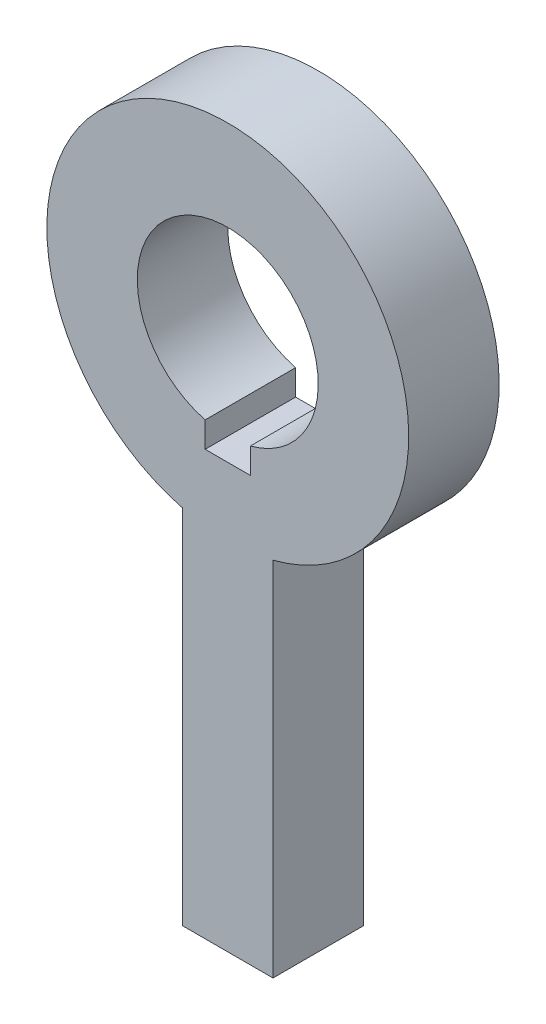
ISO-10303-21;
HEADER;
FILE_DESCRIPTION(('STEP AP214'),'2;1');
FILE_NAME('part.step','',(''),(''),'','','');
FILE_SCHEMA(('AUTOMOTIVE_DESIGN { 1 0 10303 214 1 1 1 1 }'));
ENDSEC;
DATA;
#1=APPLICATION_CONTEXT('core data for automotive mechanical design processes');
#2=APPLICATION_PROTOCOL_DEFINITION('international standard','automotive_design',2000,#1);
#3=PRODUCT_CONTEXT('',#1,'mechanical');
#4=PRODUCT('Part','Part','',(#3));
#5=PRODUCT_RELATED_PRODUCT_CATEGORY('part','',(#4));
#6=PRODUCT_DEFINITION_FORMATION('','',#4);
#7=PRODUCT_DEFINITION_CONTEXT('part definition',#1,'design');
#8=PRODUCT_DEFINITION('design','',#6,#7);
#9=PRODUCT_DEFINITION_SHAPE('','',#8);
#10=(LENGTH_UNIT() NAMED_UNIT(*) SI_UNIT(.MILLI.,.METRE.));
#11=(NAMED_UNIT(*) PLANE_ANGLE_UNIT() SI_UNIT($,.RADIAN.));
#12=(NAMED_UNIT(*) SI_UNIT($,.STERADIAN.) SOLID_ANGLE_UNIT());
#13=UNCERTAINTY_MEASURE_WITH_UNIT(LENGTH_MEASURE(1.E-05),#10,'distance_accuracy_value','');
#14=(GEOMETRIC_REPRESENTATION_CONTEXT(3) GLOBAL_UNCERTAINTY_ASSIGNED_CONTEXT((#13)) GLOBAL_UNIT_ASSIGNED_CONTEXT((#10,
#11,#12)) REPRESENTATION_CONTEXT('',''));
#15=CARTESIAN_POINT('',(0.,0.,0.));
#16=DIRECTION('',(0.,0.,1.));
#17=DIRECTION('',(1.,0.,0.));
#18=AXIS2_PLACEMENT_3D('',#15,#16,#17);
#19=CARTESIAN_POINT('',(0.,0.,10.));
#20=DIRECTION('',(0.,0.,1.));
#21=DIRECTION('',(1.,0.,0.));
#22=AXIS2_PLACEMENT_3D('',#19,#20,#21);
#23=PLANE('',#22);
#24=CARTESIAN_POINT('',(0.,0.,10.));
#25=DIRECTION('',(0.,0.,1.));
#26=DIRECTION('',(1.,0.,0.));
#27=AXIS2_PLACEMENT_3D('',#24,#25,#26);
#28=CIRCLE('',#27,20.);
#29=CARTESIAN_POINT('',(5.,-19.3649167310371,10.));
#30=VERTEX_POINT('',#29);
#31=CARTESIAN_POINT('',(-5.,-19.3649167310371,10.));
#32=VERTEX_POINT('',#31);
#33=EDGE_CURVE('E137',#30,#32,#28,.T.);
#34=ORIENTED_EDGE('',*,*,#33,.T.);
#35=DIRECTION('',(0.,-1.,0.));
#36=VECTOR('',#35,1.);
#37=CARTESIAN_POINT('',(-5.,-59.3649167310371,10.));
#38=LINE('',#37,#36);
#39=CARTESIAN_POINT('',(-5.,-59.3649167310371,10.));
#40=VERTEX_POINT('',#39);
#41=EDGE_CURVE('E140',#32,#40,#38,.T.);
#42=ORIENTED_EDGE('',*,*,#41,.T.);
#43=DIRECTION('',(1.,0.,0.));
#44=VECTOR('',#43,1.);
#45=CARTESIAN_POINT('',(-5.,-59.3649167310371,10.));
#46=LINE('',#45,#44);
#47=CARTESIAN_POINT('',(5.,-59.3649167310371,10.));
#48=VERTEX_POINT('',#47);
#49=EDGE_CURVE('E143',#40,#48,#46,.T.);
#50=ORIENTED_EDGE('',*,*,#49,.T.);
#51=DIRECTION('',(0.,1.,0.));
#52=VECTOR('',#51,1.);
#53=CARTESIAN_POINT('',(5.,-59.3649167310371,10.));
#54=LINE('',#53,#52);
#55=EDGE_CURVE('E145',#48,#30,#54,.T.);
#56=ORIENTED_EDGE('',*,*,#55,.T.);
#57=EDGE_LOOP('',(#34,#42,#50,#56));
#58=FACE_BOUND('',#57,.T.);
#59=DIRECTION('',(1.,0.,0.));
#60=VECTOR('',#59,1.);
#61=CARTESIAN_POINT('',(-2.5,-12.5,10.));
#62=LINE('',#61,#60);
#63=CARTESIAN_POINT('',(-2.5,-12.5,10.));
#64=VERTEX_POINT('',#63);
#65=CARTESIAN_POINT('',(2.5,-12.5,10.));
#66=VERTEX_POINT('',#65);
#67=EDGE_CURVE('E109',#64,#66,#62,.T.);
#68=ORIENTED_EDGE('',*,*,#67,.F.);
#69=DIRECTION('',(0.,-1.,0.));
#70=VECTOR('',#69,1.);
#71=CARTESIAN_POINT('',(-2.5,-12.5,10.));
#72=LINE('',#71,#70);
#73=CARTESIAN_POINT('',(-2.49999999999999,-9.68245836551854,10.));
#74=VERTEX_POINT('',#73);
#75=EDGE_CURVE('E101',#74,#64,#72,.T.);
#76=ORIENTED_EDGE('',*,*,#75,.F.);
#77=CARTESIAN_POINT('',(0.,0.,10.));
#78=DIRECTION('',(0.,0.,1.));
#79=DIRECTION('',(1.,0.,0.));
#80=AXIS2_PLACEMENT_3D('',#77,#78,#79);
#81=CIRCLE('',#80,10.);
#82=CARTESIAN_POINT('',(2.5,-9.68245836551854,10.));
#83=VERTEX_POINT('',#82);
#84=EDGE_CURVE('E123',#83,#74,#81,.T.);
#85=ORIENTED_EDGE('',*,*,#84,.F.);
#86=DIRECTION('',(0.,1.,0.));
#87=VECTOR('',#86,1.);
#88=CARTESIAN_POINT('',(2.5,-12.5,10.));
#89=LINE('',#88,#87);
#90=EDGE_CURVE('E121',#66,#83,#89,.T.);
#91=ORIENTED_EDGE('',*,*,#90,.F.);
#92=EDGE_LOOP('',(#68,#76,#85,#91));
#93=FACE_BOUND('',#92,.T.);
#94=ADVANCED_FACE('F36',(#58,#93),#23,.T.);
#95=CARTESIAN_POINT('',(0.,0.,0.));
#96=DIRECTION('',(0.,0.,1.));
#97=DIRECTION('',(1.,0.,0.));
#98=AXIS2_PLACEMENT_3D('',#95,#96,#97);
#99=PLANE('',#98);
#100=CARTESIAN_POINT('',(0.,0.,0.));
#101=DIRECTION('',(0.,0.,1.));
#102=DIRECTION('',(1.,0.,0.));
#103=AXIS2_PLACEMENT_3D('',#100,#101,#102);
#104=CIRCLE('',#103,20.);
#105=CARTESIAN_POINT('',(5.,-19.3649167310371,0.));
#106=VERTEX_POINT('',#105);
#107=CARTESIAN_POINT('',(-5.,-19.3649167310371,0.));
#108=VERTEX_POINT('',#107);
#109=EDGE_CURVE('E117',#106,#108,#104,.T.);
#110=ORIENTED_EDGE('',*,*,#109,.F.);
#111=DIRECTION('',(0.,1.,0.));
#112=VECTOR('',#111,1.);
#113=CARTESIAN_POINT('',(5.,-59.3649167310371,0.));
#114=LINE('',#113,#112);
#115=CARTESIAN_POINT('',(5.,-59.3649167310371,0.));
#116=VERTEX_POINT('',#115);
#117=EDGE_CURVE('E141',#116,#106,#114,.T.);
#118=ORIENTED_EDGE('',*,*,#117,.F.);
#119=DIRECTION('',(1.,0.,0.));
#120=VECTOR('',#119,1.);
#121=CARTESIAN_POINT('',(-5.,-59.3649167310371,0.));
#122=LINE('',#121,#120);
#123=CARTESIAN_POINT('',(-5.,-59.3649167310371,0.));
#124=VERTEX_POINT('',#123);
#125=EDGE_CURVE('E152',#124,#116,#122,.T.);
#126=ORIENTED_EDGE('',*,*,#125,.F.);
#127=DIRECTION('',(0.,-1.,0.));
#128=VECTOR('',#127,1.);
#129=CARTESIAN_POINT('',(-5.,-59.3649167310371,0.));
#130=LINE('',#129,#128);
#131=EDGE_CURVE('E150',#108,#124,#130,.T.);
#132=ORIENTED_EDGE('',*,*,#131,.F.);
#133=EDGE_LOOP('',(#110,#118,#126,#132));
#134=FACE_BOUND('',#133,.T.);
#135=DIRECTION('',(0.,-1.,0.));
#136=VECTOR('',#135,1.);
#137=CARTESIAN_POINT('',(-2.5,-12.5,0.));
#138=LINE('',#137,#136);
#139=CARTESIAN_POINT('',(-2.49999999999999,-9.68245836551854,0.));
#140=VERTEX_POINT('',#139);
#141=CARTESIAN_POINT('',(-2.5,-12.5,0.));
#142=VERTEX_POINT('',#141);
#143=EDGE_CURVE('E59',#140,#142,#138,.T.);
#144=ORIENTED_EDGE('',*,*,#143,.T.);
#145=DIRECTION('',(1.,0.,0.));
#146=VECTOR('',#145,1.);
#147=CARTESIAN_POINT('',(-2.5,-12.5,0.));
#148=LINE('',#147,#146);
#149=CARTESIAN_POINT('',(2.5,-12.5,0.));
#150=VERTEX_POINT('',#149);
#151=EDGE_CURVE('E116',#142,#150,#148,.T.);
#152=ORIENTED_EDGE('',*,*,#151,.T.);
#153=DIRECTION('',(0.,1.,0.));
#154=VECTOR('',#153,1.);
#155=CARTESIAN_POINT('',(2.5,-12.5,0.));
#156=LINE('',#155,#154);
#157=CARTESIAN_POINT('',(2.5,-9.68245836551854,0.));
#158=VERTEX_POINT('',#157);
#159=EDGE_CURVE('E129',#150,#158,#156,.T.);
#160=ORIENTED_EDGE('',*,*,#159,.T.);
#161=CARTESIAN_POINT('',(0.,0.,0.));
#162=DIRECTION('',(0.,0.,1.));
#163=DIRECTION('',(1.,0.,0.));
#164=AXIS2_PLACEMENT_3D('',#161,#162,#163);
#165=CIRCLE('',#164,10.);
#166=EDGE_CURVE('E110',#158,#140,#165,.T.);
#167=ORIENTED_EDGE('',*,*,#166,.T.);
#168=EDGE_LOOP('',(#144,#152,#160,#167));
#169=FACE_BOUND('',#168,.T.);
#170=ADVANCED_FACE('F170',(#134,#169),#99,.F.);
#171=CARTESIAN_POINT('',(0.,0.,10.));
#172=DIRECTION('',(0.,0.,-1.));
#173=DIRECTION('',(-1.,0.,0.));
#174=AXIS2_PLACEMENT_3D('',#171,#172,#173);
#175=CYLINDRICAL_SURFACE('',#174,20.);
#176=ORIENTED_EDGE('',*,*,#109,.T.);
#177=DIRECTION('',(0.,0.,-1.));
#178=VECTOR('',#177,1.);
#179=CARTESIAN_POINT('',(-5.,-19.3649167310371,10.));
#180=LINE('',#179,#178);
#181=EDGE_CURVE('E11',#32,#108,#180,.T.);
#182=ORIENTED_EDGE('',*,*,#181,.F.);
#183=ORIENTED_EDGE('',*,*,#33,.F.);
#184=DIRECTION('',(0.,0.,-1.));
#185=VECTOR('',#184,1.);
#186=CARTESIAN_POINT('',(5.,-19.3649167310371,10.));
#187=LINE('',#186,#185);
#188=EDGE_CURVE('E147',#30,#106,#187,.T.);
#189=ORIENTED_EDGE('',*,*,#188,.T.);
#190=EDGE_LOOP('',(#176,#182,#183,#189));
#191=FACE_BOUND('',#190,.T.);
#192=ADVANCED_FACE('F38',(#191),#175,.T.);
#193=CARTESIAN_POINT('',(-5.,-59.3649167310371,10.));
#194=DIRECTION('',(1.,0.,0.));
#195=DIRECTION('',(0.,1.,0.));
#196=AXIS2_PLACEMENT_3D('',#193,#194,#195);
#197=PLANE('',#196);
#198=ORIENTED_EDGE('',*,*,#131,.T.);
#199=DIRECTION('',(0.,0.,-1.));
#200=VECTOR('',#199,1.);
#201=CARTESIAN_POINT('',(-5.,-59.3649167310371,10.));
#202=LINE('',#201,#200);
#203=EDGE_CURVE('E44',#40,#124,#202,.T.);
#204=ORIENTED_EDGE('',*,*,#203,.F.);
#205=ORIENTED_EDGE('',*,*,#41,.F.);
#206=ORIENTED_EDGE('',*,*,#181,.T.);
#207=EDGE_LOOP('',(#198,#204,#205,#206));
#208=FACE_BOUND('',#207,.T.);
#209=ADVANCED_FACE('F180',(#208),#197,.F.);
#210=CARTESIAN_POINT('',(-5.,-59.3649167310371,10.));
#211=DIRECTION('',(0.,1.,0.));
#212=DIRECTION('',(0.,0.,1.));
#213=AXIS2_PLACEMENT_3D('',#210,#211,#212);
#214=PLANE('',#213);
#215=ORIENTED_EDGE('',*,*,#125,.T.);
#216=DIRECTION('',(0.,0.,-1.));
#217=VECTOR('',#216,1.);
#218=CARTESIAN_POINT('',(5.,-59.3649167310371,10.));
#219=LINE('',#218,#217);
#220=EDGE_CURVE('E157',#48,#116,#219,.T.);
#221=ORIENTED_EDGE('',*,*,#220,.F.);
#222=ORIENTED_EDGE('',*,*,#49,.F.);
#223=ORIENTED_EDGE('',*,*,#203,.T.);
#224=EDGE_LOOP('',(#215,#221,#222,#223));
#225=FACE_BOUND('',#224,.T.);
#226=ADVANCED_FACE('F164',(#225),#214,.F.);
#227=CARTESIAN_POINT('',(5.,-59.3649167310371,10.));
#228=DIRECTION('',(-1.,0.,0.));
#229=DIRECTION('',(0.,-1.,0.));
#230=AXIS2_PLACEMENT_3D('',#227,#228,#229);
#231=PLANE('',#230);
#232=ORIENTED_EDGE('',*,*,#117,.T.);
#233=ORIENTED_EDGE('',*,*,#188,.F.);
#234=ORIENTED_EDGE('',*,*,#55,.F.);
#235=ORIENTED_EDGE('',*,*,#220,.T.);
#236=EDGE_LOOP('',(#232,#233,#234,#235));
#237=FACE_BOUND('',#236,.T.);
#238=ADVANCED_FACE('F174',(#237),#231,.F.);
#239=CARTESIAN_POINT('',(-2.5,-12.5,10.));
#240=DIRECTION('',(1.,0.,0.));
#241=DIRECTION('',(0.,0.,-1.));
#242=AXIS2_PLACEMENT_3D('',#239,#240,#241);
#243=PLANE('',#242);
#244=ORIENTED_EDGE('',*,*,#143,.F.);
#245=DIRECTION('',(0.,0.,-1.));
#246=VECTOR('',#245,1.);
#247=CARTESIAN_POINT('',(-2.49999999999999,-9.68245836551854,10.));
#248=LINE('',#247,#246);
#249=EDGE_CURVE('E105',#74,#140,#248,.T.);
#250=ORIENTED_EDGE('',*,*,#249,.F.);
#251=ORIENTED_EDGE('',*,*,#75,.T.);
#252=DIRECTION('',(0.,0.,-1.));
#253=VECTOR('',#252,1.);
#254=CARTESIAN_POINT('',(-2.5,-12.5,10.));
#255=LINE('',#254,#253);
#256=EDGE_CURVE('E104',#64,#142,#255,.T.);
#257=ORIENTED_EDGE('',*,*,#256,.T.);
#258=EDGE_LOOP('',(#244,#250,#251,#257));
#259=FACE_BOUND('',#258,.T.);
#260=ADVANCED_FACE('F103',(#259),#243,.T.);
#261=CARTESIAN_POINT('',(-2.5,-12.5,10.));
#262=DIRECTION('',(0.,1.,0.));
#263=DIRECTION('',(0.,0.,1.));
#264=AXIS2_PLACEMENT_3D('',#261,#262,#263);
#265=PLANE('',#264);
#266=ORIENTED_EDGE('',*,*,#151,.F.);
#267=ORIENTED_EDGE('',*,*,#256,.F.);
#268=ORIENTED_EDGE('',*,*,#67,.T.);
#269=DIRECTION('',(0.,0.,-1.));
#270=VECTOR('',#269,1.);
#271=CARTESIAN_POINT('',(2.5,-12.5,10.));
#272=LINE('',#271,#270);
#273=EDGE_CURVE('E118',#66,#150,#272,.T.);
#274=ORIENTED_EDGE('',*,*,#273,.T.);
#275=EDGE_LOOP('',(#266,#267,#268,#274));
#276=FACE_BOUND('',#275,.T.);
#277=ADVANCED_FACE('F113',(#276),#265,.T.);
#278=CARTESIAN_POINT('',(2.5,-12.5,10.));
#279=DIRECTION('',(-1.,0.,0.));
#280=DIRECTION('',(0.,0.,1.));
#281=AXIS2_PLACEMENT_3D('',#278,#279,#280);
#282=PLANE('',#281);
#283=ORIENTED_EDGE('',*,*,#159,.F.);
#284=ORIENTED_EDGE('',*,*,#273,.F.);
#285=ORIENTED_EDGE('',*,*,#90,.T.);
#286=DIRECTION('',(0.,0.,-1.));
#287=VECTOR('',#286,1.);
#288=CARTESIAN_POINT('',(2.5,-9.68245836551854,10.));
#289=LINE('',#288,#287);
#290=EDGE_CURVE('E51',#83,#158,#289,.T.);
#291=ORIENTED_EDGE('',*,*,#290,.T.);
#292=EDGE_LOOP('',(#283,#284,#285,#291));
#293=FACE_BOUND('',#292,.T.);
#294=ADVANCED_FACE('F203',(#293),#282,.T.);
#295=CARTESIAN_POINT('',(0.,0.,10.));
#296=DIRECTION('',(0.,0.,-1.));
#297=DIRECTION('',(-1.,0.,0.));
#298=AXIS2_PLACEMENT_3D('',#295,#296,#297);
#299=CYLINDRICAL_SURFACE('',#298,10.);
#300=ORIENTED_EDGE('',*,*,#166,.F.);
#301=ORIENTED_EDGE('',*,*,#290,.F.);
#302=ORIENTED_EDGE('',*,*,#84,.T.);
#303=ORIENTED_EDGE('',*,*,#249,.T.);
#304=EDGE_LOOP('',(#300,#301,#302,#303));
#305=FACE_BOUND('',#304,.T.);
#306=ADVANCED_FACE('F207',(#305),#299,.F.);
#307=CLOSED_SHELL('',(#94,#170,#192,#209,#226,#238,#260,#277,#294,#306));
#308=MANIFOLD_SOLID_BREP('B2',#307);
#309=ADVANCED_BREP_SHAPE_REPRESENTATION('',(#18,#308),#14);
#310=SHAPE_DEFINITION_REPRESENTATION(#9,#309);
ENDSEC;
END-ISO-10303-21;
